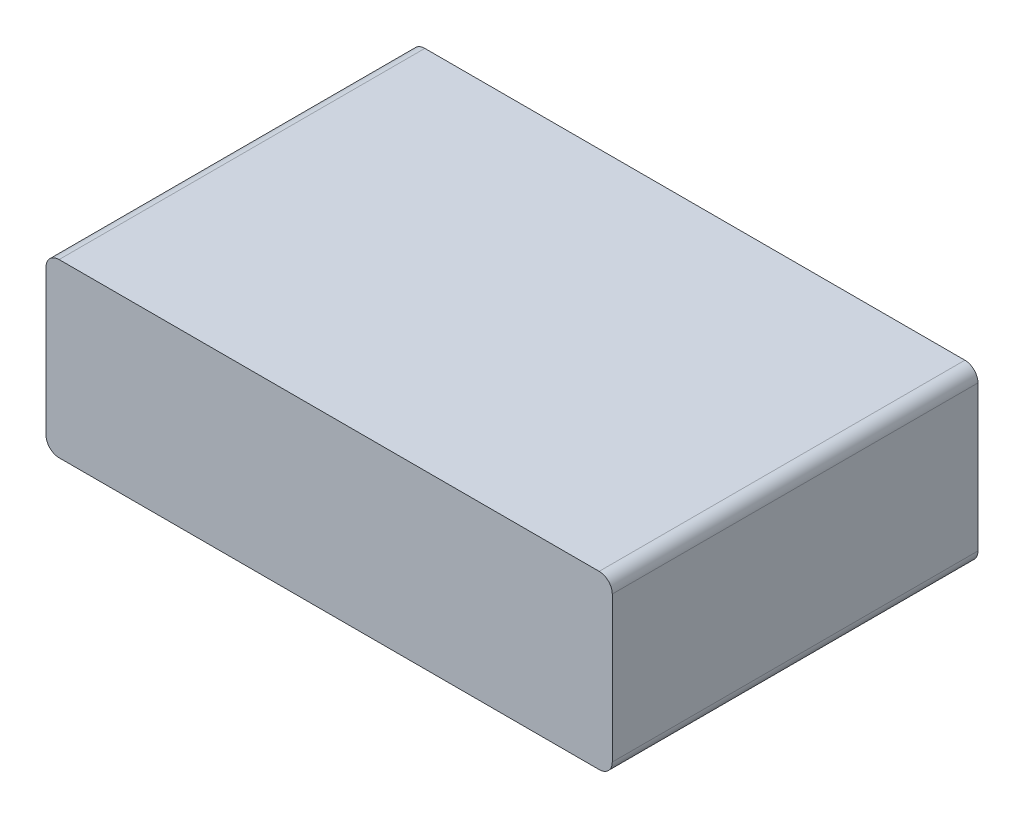
ISO-10303-21;
HEADER;
FILE_DESCRIPTION(('STEP AP214'),'2;1');
FILE_NAME('part.step','',(''),(''),'','','');
FILE_SCHEMA(('AUTOMOTIVE_DESIGN { 1 0 10303 214 1 1 1 1 }'));
ENDSEC;
DATA;
#1=APPLICATION_CONTEXT('core data for automotive mechanical design processes');
#2=APPLICATION_PROTOCOL_DEFINITION('international standard','automotive_design',2000,#1);
#3=PRODUCT_CONTEXT('',#1,'mechanical');
#4=PRODUCT('Part','Part','',(#3));
#5=PRODUCT_RELATED_PRODUCT_CATEGORY('part','',(#4));
#6=PRODUCT_DEFINITION_FORMATION('','',#4);
#7=PRODUCT_DEFINITION_CONTEXT('part definition',#1,'design');
#8=PRODUCT_DEFINITION('design','',#6,#7);
#9=PRODUCT_DEFINITION_SHAPE('','',#8);
#10=(LENGTH_UNIT() NAMED_UNIT(*) SI_UNIT(.MILLI.,.METRE.));
#11=(NAMED_UNIT(*) PLANE_ANGLE_UNIT() SI_UNIT($,.RADIAN.));
#12=(NAMED_UNIT(*) SI_UNIT($,.STERADIAN.) SOLID_ANGLE_UNIT());
#13=UNCERTAINTY_MEASURE_WITH_UNIT(LENGTH_MEASURE(1.E-05),#10,'distance_accuracy_value','');
#14=(GEOMETRIC_REPRESENTATION_CONTEXT(3) GLOBAL_UNCERTAINTY_ASSIGNED_CONTEXT((#13)) GLOBAL_UNIT_ASSIGNED_CONTEXT((#10,
#11,#12)) REPRESENTATION_CONTEXT('',''));
#15=CARTESIAN_POINT('',(0.,0.,0.));
#16=DIRECTION('',(0.,0.,1.));
#17=DIRECTION('',(1.,0.,0.));
#18=AXIS2_PLACEMENT_3D('',#15,#16,#17);
#19=CARTESIAN_POINT('',(216.,131.,-139.5));
#20=DIRECTION('',(-1.,0.,0.));
#21=DIRECTION('',(0.,0.,1.));
#22=AXIS2_PLACEMENT_3D('',#19,#20,#21);
#23=PLANE('',#22);
#24=DIRECTION('',(0.,-1.,0.));
#25=VECTOR('',#24,1.);
#26=CARTESIAN_POINT('',(216.,131.,139.5));
#27=LINE('',#26,#25);
#28=CARTESIAN_POINT('',(216.,121.,139.5));
#29=VERTEX_POINT('',#28);
#30=CARTESIAN_POINT('',(216.,9.99999999999999,139.5));
#31=VERTEX_POINT('',#30);
#32=EDGE_CURVE('E167',#29,#31,#27,.T.);
#33=ORIENTED_EDGE('',*,*,#32,.T.);
#34=DIRECTION('',(0.,0.,-1.));
#35=VECTOR('',#34,1.);
#36=CARTESIAN_POINT('',(216.,9.99999999999999,-139.5));
#37=LINE('',#36,#35);
#38=CARTESIAN_POINT('',(216.,9.99999999999999,-139.5));
#39=VERTEX_POINT('',#38);
#40=EDGE_CURVE('E198',#31,#39,#37,.T.);
#41=ORIENTED_EDGE('',*,*,#40,.T.);
#42=DIRECTION('',(0.,-1.,0.));
#43=VECTOR('',#42,1.);
#44=CARTESIAN_POINT('',(216.,131.,-139.5));
#45=LINE('',#44,#43);
#46=CARTESIAN_POINT('',(216.,121.,-139.5));
#47=VERTEX_POINT('',#46);
#48=EDGE_CURVE('E172',#47,#39,#45,.T.);
#49=ORIENTED_EDGE('',*,*,#48,.F.);
#50=DIRECTION('',(0.,0.,-1.));
#51=VECTOR('',#50,1.);
#52=CARTESIAN_POINT('',(216.,121.,139.5));
#53=LINE('',#52,#51);
#54=EDGE_CURVE('E196',#47,#29,#53,.F.);
#55=ORIENTED_EDGE('',*,*,#54,.T.);
#56=EDGE_LOOP('',(#33,#41,#49,#55));
#57=FACE_BOUND('',#56,.T.);
#58=ADVANCED_FACE('F42',(#57),#23,.F.);
#59=CARTESIAN_POINT('',(-216.,131.,-139.5));
#60=DIRECTION('',(0.,0.,1.));
#61=DIRECTION('',(1.,0.,0.));
#62=AXIS2_PLACEMENT_3D('',#59,#60,#61);
#63=PLANE('',#62);
#64=DIRECTION('',(-1.,0.,0.));
#65=VECTOR('',#64,1.);
#66=CARTESIAN_POINT('',(-216.,0.,-139.5));
#67=LINE('',#66,#65);
#68=CARTESIAN_POINT('',(206.,0.,-139.5));
#69=VERTEX_POINT('',#68);
#70=CARTESIAN_POINT('',(-206.,0.,-139.5));
#71=VERTEX_POINT('',#70);
#72=EDGE_CURVE('E383',#69,#71,#67,.T.);
#73=ORIENTED_EDGE('',*,*,#72,.T.);
#74=CARTESIAN_POINT('',(-206.,9.99999999999999,-139.5));
#75=DIRECTION('',(0.,0.,1.));
#76=DIRECTION('',(1.,0.,0.));
#77=AXIS2_PLACEMENT_3D('',#74,#75,#76);
#78=CIRCLE('',#77,10.);
#79=CARTESIAN_POINT('',(-216.,9.99999999999999,-139.5));
#80=VERTEX_POINT('',#79);
#81=EDGE_CURVE('E189',#71,#80,#78,.F.);
#82=ORIENTED_EDGE('',*,*,#81,.T.);
#83=DIRECTION('',(0.,-1.,0.));
#84=VECTOR('',#83,1.);
#85=CARTESIAN_POINT('',(-216.,131.,-139.5));
#86=LINE('',#85,#84);
#87=CARTESIAN_POINT('',(-216.,121.,-139.5));
#88=VERTEX_POINT('',#87);
#89=EDGE_CURVE('E166',#88,#80,#86,.T.);
#90=ORIENTED_EDGE('',*,*,#89,.F.);
#91=CARTESIAN_POINT('',(-206.,121.,-139.5));
#92=DIRECTION('',(0.,0.,1.));
#93=DIRECTION('',(1.,0.,0.));
#94=AXIS2_PLACEMENT_3D('',#91,#92,#93);
#95=CIRCLE('',#94,10.);
#96=CARTESIAN_POINT('',(-206.,131.,-139.5));
#97=VERTEX_POINT('',#96);
#98=EDGE_CURVE('E171',#88,#97,#95,.F.);
#99=ORIENTED_EDGE('',*,*,#98,.T.);
#100=DIRECTION('',(-1.,0.,0.));
#101=VECTOR('',#100,1.);
#102=CARTESIAN_POINT('',(-216.,131.,-139.5));
#103=LINE('',#102,#101);
#104=CARTESIAN_POINT('',(206.,131.,-139.5));
#105=VERTEX_POINT('',#104);
#106=EDGE_CURVE('E382',#105,#97,#103,.T.);
#107=ORIENTED_EDGE('',*,*,#106,.F.);
#108=CARTESIAN_POINT('',(206.,121.,-139.5));
#109=DIRECTION('',(0.,0.,1.));
#110=DIRECTION('',(1.,0.,0.));
#111=AXIS2_PLACEMENT_3D('',#108,#109,#110);
#112=CIRCLE('',#111,10.);
#113=EDGE_CURVE('E101',#105,#47,#112,.F.);
#114=ORIENTED_EDGE('',*,*,#113,.T.);
#115=ORIENTED_EDGE('',*,*,#48,.T.);
#116=CARTESIAN_POINT('',(206.,9.99999999999999,-139.5));
#117=DIRECTION('',(0.,0.,1.));
#118=DIRECTION('',(1.,0.,0.));
#119=AXIS2_PLACEMENT_3D('',#116,#117,#118);
#120=CIRCLE('',#119,10.);
#121=EDGE_CURVE('E93',#39,#69,#120,.F.);
#122=ORIENTED_EDGE('',*,*,#121,.T.);
#123=EDGE_LOOP('',(#73,#82,#90,#99,#107,#114,#115,#122));
#124=FACE_BOUND('',#123,.T.);
#125=ADVANCED_FACE('F352',(#124),#63,.F.);
#126=CARTESIAN_POINT('',(-216.,131.,-139.5));
#127=DIRECTION('',(1.,0.,0.));
#128=DIRECTION('',(0.,0.,-1.));
#129=AXIS2_PLACEMENT_3D('',#126,#127,#128);
#130=PLANE('',#129);
#131=ORIENTED_EDGE('',*,*,#89,.T.);
#132=DIRECTION('',(0.,0.,1.));
#133=VECTOR('',#132,1.);
#134=CARTESIAN_POINT('',(-216.,9.99999999999999,-139.5));
#135=LINE('',#134,#133);
#136=CARTESIAN_POINT('',(-216.,9.99999999999999,139.5));
#137=VERTEX_POINT('',#136);
#138=EDGE_CURVE('E165',#80,#137,#135,.T.);
#139=ORIENTED_EDGE('',*,*,#138,.T.);
#140=DIRECTION('',(0.,-1.,0.));
#141=VECTOR('',#140,1.);
#142=CARTESIAN_POINT('',(-216.,131.,139.5));
#143=LINE('',#142,#141);
#144=CARTESIAN_POINT('',(-216.,121.,139.5));
#145=VERTEX_POINT('',#144);
#146=EDGE_CURVE('E148',#145,#137,#143,.T.);
#147=ORIENTED_EDGE('',*,*,#146,.F.);
#148=DIRECTION('',(0.,0.,1.));
#149=VECTOR('',#148,1.);
#150=CARTESIAN_POINT('',(-216.,121.,-139.5));
#151=LINE('',#150,#149);
#152=EDGE_CURVE('E162',#145,#88,#151,.F.);
#153=ORIENTED_EDGE('',*,*,#152,.T.);
#154=EDGE_LOOP('',(#131,#139,#147,#153));
#155=FACE_BOUND('',#154,.T.);
#156=ADVANCED_FACE('F161',(#155),#130,.F.);
#157=CARTESIAN_POINT('',(-216.,131.,139.5));
#158=DIRECTION('',(0.,0.,-1.));
#159=DIRECTION('',(-1.,0.,0.));
#160=AXIS2_PLACEMENT_3D('',#157,#158,#159);
#161=PLANE('',#160);
#162=ORIENTED_EDGE('',*,*,#146,.T.);
#163=CARTESIAN_POINT('',(-206.,9.99999999999999,139.5));
#164=DIRECTION('',(0.,0.,-1.));
#165=DIRECTION('',(-1.,0.,0.));
#166=AXIS2_PLACEMENT_3D('',#163,#164,#165);
#167=CIRCLE('',#166,10.);
#168=CARTESIAN_POINT('',(-206.,0.,139.5));
#169=VERTEX_POINT('',#168);
#170=EDGE_CURVE('E155',#137,#169,#167,.F.);
#171=ORIENTED_EDGE('',*,*,#170,.T.);
#172=DIRECTION('',(1.,0.,0.));
#173=VECTOR('',#172,1.);
#174=CARTESIAN_POINT('',(-216.,0.,139.5));
#175=LINE('',#174,#173);
#176=CARTESIAN_POINT('',(206.,0.,139.5));
#177=VERTEX_POINT('',#176);
#178=EDGE_CURVE('E380',#169,#177,#175,.T.);
#179=ORIENTED_EDGE('',*,*,#178,.T.);
#180=CARTESIAN_POINT('',(206.,9.99999999999999,139.5));
#181=DIRECTION('',(0.,0.,-1.));
#182=DIRECTION('',(-1.,0.,0.));
#183=AXIS2_PLACEMENT_3D('',#180,#181,#182);
#184=CIRCLE('',#183,10.);
#185=EDGE_CURVE('E156',#177,#31,#184,.F.);
#186=ORIENTED_EDGE('',*,*,#185,.T.);
#187=ORIENTED_EDGE('',*,*,#32,.F.);
#188=CARTESIAN_POINT('',(206.,121.,139.5));
#189=DIRECTION('',(0.,0.,-1.));
#190=DIRECTION('',(-1.,0.,0.));
#191=AXIS2_PLACEMENT_3D('',#188,#189,#190);
#192=CIRCLE('',#191,10.);
#193=CARTESIAN_POINT('',(206.,131.,139.5));
#194=VERTEX_POINT('',#193);
#195=EDGE_CURVE('E174',#29,#194,#192,.F.);
#196=ORIENTED_EDGE('',*,*,#195,.T.);
#197=DIRECTION('',(1.,0.,0.));
#198=VECTOR('',#197,1.);
#199=CARTESIAN_POINT('',(-216.,131.,139.5));
#200=LINE('',#199,#198);
#201=CARTESIAN_POINT('',(-206.,131.,139.5));
#202=VERTEX_POINT('',#201);
#203=EDGE_CURVE('E150',#202,#194,#200,.T.);
#204=ORIENTED_EDGE('',*,*,#203,.F.);
#205=CARTESIAN_POINT('',(-206.,121.,139.5));
#206=DIRECTION('',(0.,0.,-1.));
#207=DIRECTION('',(-1.,0.,0.));
#208=AXIS2_PLACEMENT_3D('',#205,#206,#207);
#209=CIRCLE('',#208,10.);
#210=EDGE_CURVE('E145',#202,#145,#209,.F.);
#211=ORIENTED_EDGE('',*,*,#210,.T.);
#212=EDGE_LOOP('',(#162,#171,#179,#186,#187,#196,#204,#211));
#213=FACE_BOUND('',#212,.T.);
#214=ADVANCED_FACE('F147',(#213),#161,.F.);
#215=CARTESIAN_POINT('',(0.,131.,0.));
#216=DIRECTION('',(0.,1.,0.));
#217=DIRECTION('',(0.,0.,1.));
#218=AXIS2_PLACEMENT_3D('',#215,#216,#217);
#219=PLANE('',#218);
#220=ORIENTED_EDGE('',*,*,#106,.T.);
#221=DIRECTION('',(0.,0.,1.));
#222=VECTOR('',#221,1.);
#223=CARTESIAN_POINT('',(-206.,131.,139.5));
#224=LINE('',#223,#222);
#225=EDGE_CURVE('E194',#97,#202,#224,.T.);
#226=ORIENTED_EDGE('',*,*,#225,.T.);
#227=ORIENTED_EDGE('',*,*,#203,.T.);
#228=DIRECTION('',(0.,0.,-1.));
#229=VECTOR('',#228,1.);
#230=CARTESIAN_POINT('',(206.,131.,-139.5));
#231=LINE('',#230,#229);
#232=EDGE_CURVE('E191',#194,#105,#231,.T.);
#233=ORIENTED_EDGE('',*,*,#232,.T.);
#234=EDGE_LOOP('',(#220,#226,#227,#233));
#235=FACE_BOUND('',#234,.T.);
#236=ADVANCED_FACE('F325',(#235),#219,.T.);
#237=CARTESIAN_POINT('',(0.,0.,0.));
#238=DIRECTION('',(0.,1.,0.));
#239=DIRECTION('',(0.,0.,1.));
#240=AXIS2_PLACEMENT_3D('',#237,#238,#239);
#241=PLANE('',#240);
#242=ORIENTED_EDGE('',*,*,#178,.F.);
#243=DIRECTION('',(0.,0.,1.));
#244=VECTOR('',#243,1.);
#245=CARTESIAN_POINT('',(-206.,0.,0.));
#246=LINE('',#245,#244);
#247=EDGE_CURVE('E184',#169,#71,#246,.F.);
#248=ORIENTED_EDGE('',*,*,#247,.T.);
#249=ORIENTED_EDGE('',*,*,#72,.F.);
#250=DIRECTION('',(0.,0.,-1.));
#251=VECTOR('',#250,1.);
#252=CARTESIAN_POINT('',(206.,0.,0.));
#253=LINE('',#252,#251);
#254=EDGE_CURVE('E182',#69,#177,#253,.F.);
#255=ORIENTED_EDGE('',*,*,#254,.T.);
#256=EDGE_LOOP('',(#242,#248,#249,#255));
#257=FACE_BOUND('',#256,.T.);
#258=ADVANCED_FACE('F315',(#257),#241,.F.);
#259=CARTESIAN_POINT('',(-206.,9.99999999999999,-139.5));
#260=DIRECTION('',(0.,0.,1.));
#261=DIRECTION('',(1.,0.,0.));
#262=AXIS2_PLACEMENT_3D('',#259,#260,#261);
#263=CYLINDRICAL_SURFACE('',#262,10.);
#264=ORIENTED_EDGE('',*,*,#81,.F.);
#265=ORIENTED_EDGE('',*,*,#247,.F.);
#266=ORIENTED_EDGE('',*,*,#170,.F.);
#267=ORIENTED_EDGE('',*,*,#138,.F.);
#268=EDGE_LOOP('',(#264,#265,#266,#267));
#269=FACE_BOUND('',#268,.T.);
#270=ADVANCED_FACE('F306',(#269),#263,.T.);
#271=CARTESIAN_POINT('',(-206.,121.,0.));
#272=DIRECTION('',(0.,0.,-1.));
#273=DIRECTION('',(-1.,0.,0.));
#274=AXIS2_PLACEMENT_3D('',#271,#272,#273);
#275=CYLINDRICAL_SURFACE('',#274,10.);
#276=ORIENTED_EDGE('',*,*,#98,.F.);
#277=ORIENTED_EDGE('',*,*,#152,.F.);
#278=ORIENTED_EDGE('',*,*,#210,.F.);
#279=ORIENTED_EDGE('',*,*,#225,.F.);
#280=EDGE_LOOP('',(#276,#277,#278,#279));
#281=FACE_BOUND('',#280,.T.);
#282=ADVANCED_FACE('F170',(#281),#275,.T.);
#283=CARTESIAN_POINT('',(206.,9.99999999999999,-139.5));
#284=DIRECTION('',(0.,0.,-1.));
#285=DIRECTION('',(-1.,0.,0.));
#286=AXIS2_PLACEMENT_3D('',#283,#284,#285);
#287=CYLINDRICAL_SURFACE('',#286,10.);
#288=ORIENTED_EDGE('',*,*,#185,.F.);
#289=ORIENTED_EDGE('',*,*,#254,.F.);
#290=ORIENTED_EDGE('',*,*,#121,.F.);
#291=ORIENTED_EDGE('',*,*,#40,.F.);
#292=EDGE_LOOP('',(#288,#289,#290,#291));
#293=FACE_BOUND('',#292,.T.);
#294=ADVANCED_FACE('F289',(#293),#287,.T.);
#295=CARTESIAN_POINT('',(206.,121.,0.));
#296=DIRECTION('',(0.,0.,1.));
#297=DIRECTION('',(1.,0.,0.));
#298=AXIS2_PLACEMENT_3D('',#295,#296,#297);
#299=CYLINDRICAL_SURFACE('',#298,10.);
#300=ORIENTED_EDGE('',*,*,#195,.F.);
#301=ORIENTED_EDGE('',*,*,#54,.F.);
#302=ORIENTED_EDGE('',*,*,#113,.F.);
#303=ORIENTED_EDGE('',*,*,#232,.F.);
#304=EDGE_LOOP('',(#300,#301,#302,#303));
#305=FACE_BOUND('',#304,.T.);
#306=ADVANCED_FACE('F285',(#305),#299,.T.);
#307=CLOSED_SHELL('',(#58,#125,#156,#214,#236,#258,#270,#282,#294,#306));
#308=CARTESIAN_POINT('',(206.,131.,-139.5));
#309=DIRECTION('',(-1.,0.,0.));
#310=DIRECTION('',(0.,0.,1.));
#311=AXIS2_PLACEMENT_3D('',#308,#309,#310);
#312=PLANE('',#311);
#313=DIRECTION('',(0.,-1.,0.));
#314=VECTOR('',#313,1.);
#315=CARTESIAN_POINT('',(206.,131.,129.5));
#316=LINE('',#315,#314);
#317=CARTESIAN_POINT('',(206.,121.,129.5));
#318=VERTEX_POINT('',#317);
#319=CARTESIAN_POINT('',(206.,10.,129.5));
#320=VERTEX_POINT('',#319);
#321=EDGE_CURVE('E46',#318,#320,#316,.T.);
#322=ORIENTED_EDGE('',*,*,#321,.F.);
#323=DIRECTION('',(0.,0.,1.));
#324=VECTOR('',#323,1.);
#325=CARTESIAN_POINT('',(206.,121.,0.));
#326=LINE('',#325,#324);
#327=CARTESIAN_POINT('',(206.,121.,-129.5));
#328=VERTEX_POINT('',#327);
#329=EDGE_CURVE('E218',#328,#318,#326,.T.);
#330=ORIENTED_EDGE('',*,*,#329,.F.);
#331=DIRECTION('',(0.,-1.,0.));
#332=VECTOR('',#331,1.);
#333=CARTESIAN_POINT('',(206.,131.,-129.5));
#334=LINE('',#333,#332);
#335=CARTESIAN_POINT('',(206.,10.,-129.5));
#336=VERTEX_POINT('',#335);
#337=EDGE_CURVE('E82',#328,#336,#334,.T.);
#338=ORIENTED_EDGE('',*,*,#337,.T.);
#339=DIRECTION('',(0.,0.,1.));
#340=VECTOR('',#339,1.);
#341=CARTESIAN_POINT('',(206.,10.,0.));
#342=LINE('',#341,#340);
#343=EDGE_CURVE('E11',#336,#320,#342,.T.);
#344=ORIENTED_EDGE('',*,*,#343,.T.);
#345=EDGE_LOOP('',(#322,#330,#338,#344));
#346=FACE_BOUND('',#345,.T.);
#347=ADVANCED_FACE('F225',(#346),#312,.T.);
#348=CARTESIAN_POINT('',(-216.,131.,-129.5));
#349=DIRECTION('',(0.,0.,1.));
#350=DIRECTION('',(1.,0.,0.));
#351=AXIS2_PLACEMENT_3D('',#348,#349,#350);
#352=PLANE('',#351);
#353=DIRECTION('',(-1.,0.,0.));
#354=VECTOR('',#353,1.);
#355=CARTESIAN_POINT('',(-216.,9.99999999999999,-129.5));
#356=LINE('',#355,#354);
#357=CARTESIAN_POINT('',(-206.,10.,-129.5));
#358=VERTEX_POINT('',#357);
#359=EDGE_CURVE('E62',#336,#358,#356,.T.);
#360=ORIENTED_EDGE('',*,*,#359,.F.);
#361=ORIENTED_EDGE('',*,*,#337,.F.);
#362=DIRECTION('',(-1.,0.,0.));
#363=VECTOR('',#362,1.);
#364=CARTESIAN_POINT('',(-216.,121.,-129.5));
#365=LINE('',#364,#363);
#366=CARTESIAN_POINT('',(-206.,121.,-129.5));
#367=VERTEX_POINT('',#366);
#368=EDGE_CURVE('E204',#328,#367,#365,.T.);
#369=ORIENTED_EDGE('',*,*,#368,.T.);
#370=DIRECTION('',(0.,-1.,0.));
#371=VECTOR('',#370,1.);
#372=CARTESIAN_POINT('',(-206.,131.,-129.5));
#373=LINE('',#372,#371);
#374=EDGE_CURVE('E215',#367,#358,#373,.T.);
#375=ORIENTED_EDGE('',*,*,#374,.T.);
#376=EDGE_LOOP('',(#360,#361,#369,#375));
#377=FACE_BOUND('',#376,.T.);
#378=ADVANCED_FACE('F233',(#377),#352,.T.);
#379=CARTESIAN_POINT('',(-206.,131.,-139.5));
#380=DIRECTION('',(1.,0.,0.));
#381=DIRECTION('',(0.,0.,-1.));
#382=AXIS2_PLACEMENT_3D('',#379,#380,#381);
#383=PLANE('',#382);
#384=ORIENTED_EDGE('',*,*,#374,.F.);
#385=DIRECTION('',(0.,0.,-1.));
#386=VECTOR('',#385,1.);
#387=CARTESIAN_POINT('',(-206.,121.,0.));
#388=LINE('',#387,#386);
#389=CARTESIAN_POINT('',(-206.,121.,129.5));
#390=VERTEX_POINT('',#389);
#391=EDGE_CURVE('E212',#390,#367,#388,.T.);
#392=ORIENTED_EDGE('',*,*,#391,.F.);
#393=DIRECTION('',(0.,-1.,0.));
#394=VECTOR('',#393,1.);
#395=CARTESIAN_POINT('',(-206.,131.,129.5));
#396=LINE('',#395,#394);
#397=CARTESIAN_POINT('',(-206.,10.,129.5));
#398=VERTEX_POINT('',#397);
#399=EDGE_CURVE('E209',#390,#398,#396,.T.);
#400=ORIENTED_EDGE('',*,*,#399,.T.);
#401=DIRECTION('',(0.,0.,-1.));
#402=VECTOR('',#401,1.);
#403=CARTESIAN_POINT('',(-206.,10.,0.));
#404=LINE('',#403,#402);
#405=EDGE_CURVE('E53',#398,#358,#404,.T.);
#406=ORIENTED_EDGE('',*,*,#405,.T.);
#407=EDGE_LOOP('',(#384,#392,#400,#406));
#408=FACE_BOUND('',#407,.T.);
#409=ADVANCED_FACE('F232',(#408),#383,.T.);
#410=CARTESIAN_POINT('',(-216.,131.,129.5));
#411=DIRECTION('',(0.,0.,-1.));
#412=DIRECTION('',(-1.,0.,0.));
#413=AXIS2_PLACEMENT_3D('',#410,#411,#412);
#414=PLANE('',#413);
#415=ORIENTED_EDGE('',*,*,#399,.F.);
#416=DIRECTION('',(1.,0.,0.));
#417=VECTOR('',#416,1.);
#418=CARTESIAN_POINT('',(-216.,121.,129.5));
#419=LINE('',#418,#417);
#420=EDGE_CURVE('E202',#390,#318,#419,.T.);
#421=ORIENTED_EDGE('',*,*,#420,.T.);
#422=ORIENTED_EDGE('',*,*,#321,.T.);
#423=DIRECTION('',(1.,0.,0.));
#424=VECTOR('',#423,1.);
#425=CARTESIAN_POINT('',(-216.,9.99999999999999,129.5));
#426=LINE('',#425,#424);
#427=EDGE_CURVE('E206',#398,#320,#426,.T.);
#428=ORIENTED_EDGE('',*,*,#427,.F.);
#429=EDGE_LOOP('',(#415,#421,#422,#428));
#430=FACE_BOUND('',#429,.T.);
#431=ADVANCED_FACE('F228',(#430),#414,.T.);
#432=CARTESIAN_POINT('',(0.,121.,0.));
#433=DIRECTION('',(0.,1.,0.));
#434=DIRECTION('',(0.,0.,1.));
#435=AXIS2_PLACEMENT_3D('',#432,#433,#434);
#436=PLANE('',#435);
#437=ORIENTED_EDGE('',*,*,#368,.F.);
#438=ORIENTED_EDGE('',*,*,#329,.T.);
#439=ORIENTED_EDGE('',*,*,#420,.F.);
#440=ORIENTED_EDGE('',*,*,#391,.T.);
#441=EDGE_LOOP('',(#437,#438,#439,#440));
#442=FACE_BOUND('',#441,.T.);
#443=ADVANCED_FACE('F223',(#442),#436,.F.);
#444=CARTESIAN_POINT('',(0.,10.,0.));
#445=DIRECTION('',(0.,1.,0.));
#446=DIRECTION('',(0.,0.,1.));
#447=AXIS2_PLACEMENT_3D('',#444,#445,#446);
#448=PLANE('',#447);
#449=ORIENTED_EDGE('',*,*,#427,.T.);
#450=ORIENTED_EDGE('',*,*,#343,.F.);
#451=ORIENTED_EDGE('',*,*,#359,.T.);
#452=ORIENTED_EDGE('',*,*,#405,.F.);
#453=EDGE_LOOP('',(#449,#450,#451,#452));
#454=FACE_BOUND('',#453,.T.);
#455=ADVANCED_FACE('F44',(#454),#448,.T.);
#456=CLOSED_SHELL('',(#347,#378,#409,#431,#443,#455));
#457=ORIENTED_CLOSED_SHELL('',*,#456,.T.);
#458=BREP_WITH_VOIDS('B2',#307,(#457));
#459=ADVANCED_BREP_SHAPE_REPRESENTATION('',(#18,#458),#14);
#460=SHAPE_DEFINITION_REPRESENTATION(#9,#459);
ENDSEC;
END-ISO-10303-21;
